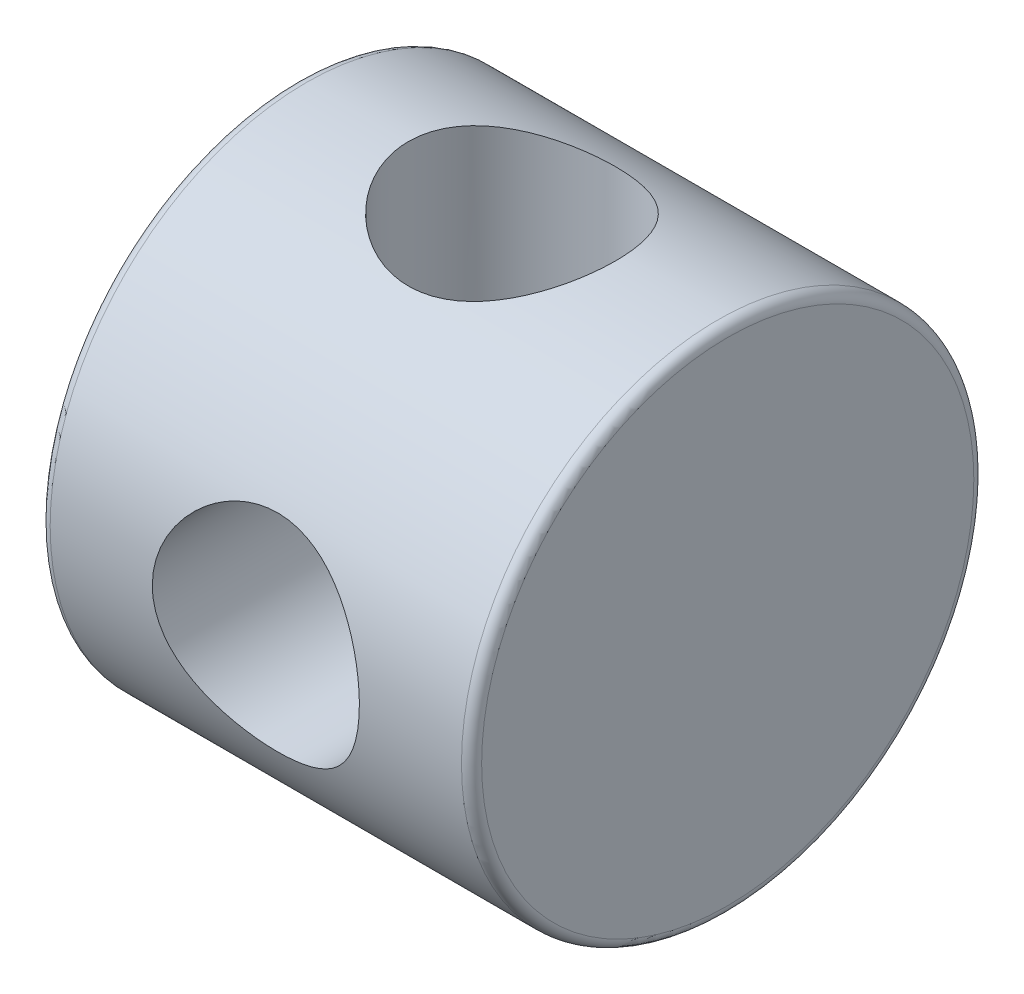
ISO-10303-21;
HEADER;
FILE_DESCRIPTION(('STEP AP214'),'2;1');
FILE_NAME('part.step','',(''),(''),'','','');
FILE_SCHEMA(('AUTOMOTIVE_DESIGN { 1 0 10303 214 1 1 1 1 }'));
ENDSEC;
DATA;
#1=APPLICATION_CONTEXT('core data for automotive mechanical design processes');
#2=APPLICATION_PROTOCOL_DEFINITION('international standard','automotive_design',2000,#1);
#3=PRODUCT_CONTEXT('',#1,'mechanical');
#4=PRODUCT('Part','Part','',(#3));
#5=PRODUCT_RELATED_PRODUCT_CATEGORY('part','',(#4));
#6=PRODUCT_DEFINITION_FORMATION('','',#4);
#7=PRODUCT_DEFINITION_CONTEXT('part definition',#1,'design');
#8=PRODUCT_DEFINITION('design','',#6,#7);
#9=PRODUCT_DEFINITION_SHAPE('','',#8);
#10=(LENGTH_UNIT() NAMED_UNIT(*) SI_UNIT(.MILLI.,.METRE.));
#11=(NAMED_UNIT(*) PLANE_ANGLE_UNIT() SI_UNIT($,.RADIAN.));
#12=(NAMED_UNIT(*) SI_UNIT($,.STERADIAN.) SOLID_ANGLE_UNIT());
#13=UNCERTAINTY_MEASURE_WITH_UNIT(LENGTH_MEASURE(1.E-05),#10,'distance_accuracy_value','');
#14=(GEOMETRIC_REPRESENTATION_CONTEXT(3) GLOBAL_UNCERTAINTY_ASSIGNED_CONTEXT((#13)) GLOBAL_UNIT_ASSIGNED_CONTEXT((#10,
#11,#12)) REPRESENTATION_CONTEXT('',''));
#15=CARTESIAN_POINT('',(0.,0.,0.));
#16=DIRECTION('',(0.,0.,1.));
#17=DIRECTION('',(1.,0.,0.));
#18=AXIS2_PLACEMENT_3D('',#15,#16,#17);
#19=CARTESIAN_POINT('',(-1.651,-2.413,0.));
#20=DIRECTION('',(0.,1.,0.));
#21=DIRECTION('',(0.,0.,1.));
#22=AXIS2_PLACEMENT_3D('',#19,#20,#21);
#23=CYLINDRICAL_SURFACE('',#22,0.975);
#24=CARTESIAN_POINT('',(-1.651,-2.20724806036839,0.975));
#25=CARTESIAN_POINT('',(-1.59877755671493,-2.20725136965086,0.974996773633798));
#26=CARTESIAN_POINT('',(-1.54650902392363,-2.20912596864469,0.970782539566692));
#27=CARTESIAN_POINT('',(-1.44351572456661,-2.21638016304338,0.954099655404558));
#28=CARTESIAN_POINT('',(-1.39279339872527,-2.22176502709611,0.941618596965268));
#29=CARTESIAN_POINT('',(-1.29449823912022,-2.23532397381558,0.908957978076945));
#30=CARTESIAN_POINT('',(-1.24691524401246,-2.24348847115901,0.888804846248834));
#31=CARTESIAN_POINT('',(-1.15580284980478,-2.2616734513362,0.841452953470062));
#32=CARTESIAN_POINT('',(-1.11227368096481,-2.27169403950062,0.814253792631827));
#33=CARTESIAN_POINT('',(-1.02795858989517,-2.29311435268041,0.751888917062757));
#34=CARTESIAN_POINT('',(-0.987439167953577,-2.30455897362016,0.716378183947321));
#35=CARTESIAN_POINT('',(-0.912737712380074,-2.32716684485715,0.639126128743022));
#36=CARTESIAN_POINT('',(-0.878557539137137,-2.33833001172777,0.597382984085831));
#37=CARTESIAN_POINT('',(-0.816166937755971,-2.35965989144668,0.506777322457651));
#38=CARTESIAN_POINT('',(-0.788253444666864,-2.3697681340365,0.457695327279943));
#39=CARTESIAN_POINT('',(-0.741193322843783,-2.38730249445335,0.355050045402772));
#40=CARTESIAN_POINT('',(-0.722043143558416,-2.39472969827422,0.301488584029474));
#41=CARTESIAN_POINT('',(-0.694010239372981,-2.40574634361331,0.194206094004759));
#42=CARTESIAN_POINT('',(-0.684667912512863,-2.40950692053236,0.140623087150691));
#43=CARTESIAN_POINT('',(-0.675034701000536,-2.41338589796678,0.0325267451879902));
#44=CARTESIAN_POINT('',(-0.674740381441646,-2.41350568064138,-0.0219862290119944));
#45=CARTESIAN_POINT('',(-0.682962300761365,-2.41019287567636,-0.12706852357368));
#46=CARTESIAN_POINT('',(-0.690974690990237,-2.40696343347413,-0.17768484127352));
#47=CARTESIAN_POINT('',(-0.7147239809174,-2.39759010740608,-0.276783279938089));
#48=CARTESIAN_POINT('',(-0.730461448882279,-2.39144600913553,-0.325265243611066));
#49=CARTESIAN_POINT('',(-0.76940653322892,-2.37672510450613,-0.419597705462042));
#50=CARTESIAN_POINT('',(-0.792723693736028,-2.36811285813551,-0.46539721892244));
#51=CARTESIAN_POINT('',(-0.846061765566593,-2.34930790001654,-0.55255041865166));
#52=CARTESIAN_POINT('',(-0.876084748319131,-2.3391147002095,-0.593902725317822));
#53=CARTESIAN_POINT('',(-0.944315075369865,-2.31737655695153,-0.673919192397163));
#54=CARTESIAN_POINT('',(-0.982934756361208,-2.30578680064105,-0.712220064461278));
#55=CARTESIAN_POINT('',(-1.06610249265835,-2.28307925372254,-0.781963440252376));
#56=CARTESIAN_POINT('',(-1.11065417607525,-2.27196175748972,-0.813401715391774));
#57=CARTESIAN_POINT('',(-1.20609306022927,-2.25114527699373,-0.86938753610472));
#58=CARTESIAN_POINT('',(-1.25713009687433,-2.24149877809259,-0.893700384128966));
#59=CARTESIAN_POINT('',(-1.36302132852767,-2.22534500614951,-0.933204805955091));
#60=CARTESIAN_POINT('',(-1.41786698381921,-2.21883095402306,-0.948416094496458));
#61=CARTESIAN_POINT('',(-1.50288765684779,-2.21201898014966,-0.964142810086234));
#62=CARTESIAN_POINT('',(-1.53232935311935,-2.21023810279291,-0.968207291965666));
#63=CARTESIAN_POINT('',(-1.59150904818929,-2.20785170648248,-0.973636791569329));
#64=CARTESIAN_POINT('',(-1.62124704381423,-2.20724617495415,-0.975001838173956));
#65=CARTESIAN_POINT('',(-1.70322244328691,-2.2072513696509,-0.9749967736337));
#66=CARTESIAN_POINT('',(-1.75549097607823,-2.20912596864478,-0.970782539566492));
#67=CARTESIAN_POINT('',(-1.85848427543525,-2.21638016304355,-0.954099655404155));
#68=CARTESIAN_POINT('',(-1.90920660127658,-2.22176502709633,-0.941618596964761));
#69=CARTESIAN_POINT('',(-2.00750176088159,-2.23532397381587,-0.908957978076235));
#70=CARTESIAN_POINT('',(-2.05508475598932,-2.24348847115933,-0.888804846248024));
#71=CARTESIAN_POINT('',(-2.14619715019693,-2.26167345133658,-0.841452953469054));
#72=CARTESIAN_POINT('',(-2.18972631903686,-2.27169403950102,-0.814253792630722));
#73=CARTESIAN_POINT('',(-2.2740414101064,-2.29311435268084,-0.751888917061453));
#74=CARTESIAN_POINT('',(-2.31456083204794,-2.3045589736206,-0.716378183945915));
#75=CARTESIAN_POINT('',(-2.38926228762132,-2.3271668448576,-0.639126128741417));
#76=CARTESIAN_POINT('',(-2.42344246086418,-2.33833001172821,-0.597382984084128));
#77=CARTESIAN_POINT('',(-2.48583306224516,-2.35965989144708,-0.506777322455784));
#78=CARTESIAN_POINT('',(-2.51374655533416,-2.36976813403687,-0.457695327278012));
#79=CARTESIAN_POINT('',(-2.56080667715701,-2.38730249445366,-0.355050045400732));
#80=CARTESIAN_POINT('',(-2.57995685644226,-2.39472969827449,-0.301488584027389));
#81=CARTESIAN_POINT('',(-2.60798976062745,-2.40574634361348,-0.194206094002631));
#82=CARTESIAN_POINT('',(-2.61733208748745,-2.40950692053248,-0.140623087148566));
#83=CARTESIAN_POINT('',(-2.62696529899953,-2.41338589796681,-0.0325267451858946));
#84=CARTESIAN_POINT('',(-2.62725961855831,-2.41350568064136,0.0219862290140636));
#85=CARTESIAN_POINT('',(-2.61903769923837,-2.41019287567625,0.127068523575694));
#86=CARTESIAN_POINT('',(-2.6110253090094,-2.40696343347399,0.177684841275506));
#87=CARTESIAN_POINT('',(-2.58727601908203,-2.39759010740585,0.276783279940002));
#88=CARTESIAN_POINT('',(-2.57153855111706,-2.39144600913528,0.325265243612935));
#89=CARTESIAN_POINT('',(-2.53259346677023,-2.37672510450582,0.419597705463831));
#90=CARTESIAN_POINT('',(-2.50927630626302,-2.36811285813517,0.465397218924194));
#91=CARTESIAN_POINT('',(-2.45593823443226,-2.34930790001615,0.552550418653326));
#92=CARTESIAN_POINT('',(-2.42591525167963,-2.33911470020909,0.593902725319438));
#93=CARTESIAN_POINT('',(-2.35768492462871,-2.31737655695109,0.673919192398663));
#94=CARTESIAN_POINT('',(-2.31906524363727,-2.30578680064061,0.712220064462711));
#95=CARTESIAN_POINT('',(-2.23589750733993,-2.2830792537221,0.781963440253659));
#96=CARTESIAN_POINT('',(-2.19134582392295,-2.27196175748929,0.813401715392974));
#97=CARTESIAN_POINT('',(-2.09590693976878,-2.25114527699334,0.869387536105719));
#98=CARTESIAN_POINT('',(-2.04486990312367,-2.24149877809224,0.89370038412985));
#99=CARTESIAN_POINT('',(-1.93897867147023,-2.22534500614923,0.933204805955737));
#100=CARTESIAN_POINT('',(-1.88413301617867,-2.21883095402283,0.948416094496981));
#101=CARTESIAN_POINT('',(-1.79911234315071,-2.21201898014957,0.964142810086445));
#102=CARTESIAN_POINT('',(-1.76967064687981,-2.21023810279287,0.968207291965749));
#103=CARTESIAN_POINT('',(-1.7104909518112,-2.2078517064825,0.973636791569279));
#104=CARTESIAN_POINT('',(-1.68075295618693,-2.20724617495418,0.9750018381739));
#105=CARTESIAN_POINT('',(-1.651,-2.20724806036839,0.975));
#106=B_SPLINE_CURVE_WITH_KNOTS('',3,(#24,#25,#26,#27,#28,#29,#30,#31,#32,#33,#34,#35,#36,#37,
#38,#39,#40,#41,#42,#43,#44,#45,#46,#47,#48,#49,#50,#51,#52,#53,#54,#55,#56,#57,#58,#59,#60,#61,
#62,#63,#64,#65,#66,#67,#68,#69,#70,#71,#72,#73,#74,#75,#76,#77,#78,#79,#80,#81,#82,#83,#84,#85,
#86,#87,#88,#89,#90,#91,#92,#93,#94,#95,#96,#97,#98,#99,#100,#101,#102,#103,#104,#105),
.UNSPECIFIED.,.T.,.F.,(4,2,2,2,2,2,2,2,2,2,2,2,2,2,2,2,2,2,2,2,2,2,2,2,2,2,2,2,2,2,2,2,2,2,2,2,
2,2,2,2,4),(0.,0.156550021056958,0.313335554797947,0.469585813392964,0.625844941697533,
0.790361033050518,0.954925329057369,1.12613745409596,1.29728014913808,1.45998631039723,
1.6226307025434,1.77595612718014,1.92929283232159,2.08495222632276,2.24065977018697,
2.40675333232753,2.57294895072256,2.74412440058883,2.91492771505445,3.00412070293595,
3.09331273656504,3.24986275762206,3.4066482913631,3.56289854995818,3.7191576782628,
3.88367376961587,4.0482380656228,4.21945019066138,4.39059288570349,4.55329904696256,
4.71594343910865,4.86926886374536,5.02260556888679,5.17826496288801,5.33397250675227,
5.5000660688929,5.666261687288,5.83743713715425,6.00824045161985,6.09743343949935,
6.18662547312643),.UNSPECIFIED.);
#107=CARTESIAN_POINT('',(-1.651,-2.20724806036839,0.975));
#108=VERTEX_POINT('',#107);
#109=EDGE_CURVE('E62',#108,#108,#106,.T.);
#110=ORIENTED_EDGE('',*,*,#109,.F.);
#111=EDGE_LOOP('',(#110));
#112=FACE_BOUND('',#111,.T.);
#113=CARTESIAN_POINT('',(-1.651,0.,0.));
#114=DIRECTION('',(0.,0.707106781186547,-0.707106781186547));
#115=DIRECTION('',(0.,0.707106781186547,0.707106781186547));
#116=AXIS2_PLACEMENT_3D('',#113,#114,#115);
#117=ELLIPSE('',#116,1.37885822331377,0.975);
#118=CARTESIAN_POINT('',(-0.676,0.,0.));
#119=VERTEX_POINT('',#118);
#120=CARTESIAN_POINT('',(-2.626,0.,0.));
#121=VERTEX_POINT('',#120);
#122=EDGE_CURVE('E56',#119,#121,#117,.T.);
#123=ORIENTED_EDGE('',*,*,#122,.T.);
#124=CARTESIAN_POINT('',(-1.651,0.,0.));
#125=DIRECTION('',(0.,0.707106781186547,0.707106781186547));
#126=DIRECTION('',(0.,0.707106781186547,-0.707106781186547));
#127=AXIS2_PLACEMENT_3D('',#124,#125,#126);
#128=ELLIPSE('',#127,1.37885822331377,0.975);
#129=EDGE_CURVE('E51',#121,#119,#128,.T.);
#130=ORIENTED_EDGE('',*,*,#129,.T.);
#131=EDGE_LOOP('',(#123,#130));
#132=FACE_BOUND('',#131,.T.);
#133=ADVANCED_FACE('F16',(#112,#132),#23,.F.);
#134=CARTESIAN_POINT('',(0.380999999999999,4.42903274039352,-2.41346096080457));
#135=DIRECTION('',(-1.,0.,0.));
#136=DIRECTION('',(0.,-1.,0.));
#137=AXIS2_PLACEMENT_3D('',#134,#135,#136);
#138=PLANE('',#137);
#139=CARTESIAN_POINT('',(0.380999999999999,0.,0.));
#140=DIRECTION('',(-1.,0.,0.));
#141=DIRECTION('',(0.,-1.,0.));
#142=AXIS2_PLACEMENT_3D('',#139,#140,#141);
#143=CIRCLE('',#142,2.318);
#144=CARTESIAN_POINT('',(0.381,-2.318,0.));
#145=VERTEX_POINT('',#144);
#146=CARTESIAN_POINT('',(0.380999999999999,2.318,0.));
#147=VERTEX_POINT('',#146);
#148=EDGE_CURVE('E71',#145,#147,#143,.T.);
#149=ORIENTED_EDGE('',*,*,#148,.F.);
#150=CARTESIAN_POINT('',(0.380999999999999,0.,0.));
#151=DIRECTION('',(-1.,0.,0.));
#152=DIRECTION('',(0.,1.,0.));
#153=AXIS2_PLACEMENT_3D('',#150,#151,#152);
#154=CIRCLE('',#153,2.318);
#155=EDGE_CURVE('E74',#147,#145,#154,.T.);
#156=ORIENTED_EDGE('',*,*,#155,.F.);
#157=EDGE_LOOP('',(#149,#156));
#158=FACE_BOUND('',#157,.T.);
#159=ADVANCED_FACE('F143',(#158),#138,.F.);
#160=CARTESIAN_POINT('',(-3.683,3.52414946477353,-2.41346096080457));
#161=DIRECTION('',(1.,0.,0.));
#162=DIRECTION('',(0.,1.,0.));
#163=AXIS2_PLACEMENT_3D('',#160,#161,#162);
#164=PLANE('',#163);
#165=CARTESIAN_POINT('',(-3.683,0.,0.));
#166=DIRECTION('',(1.,0.,0.));
#167=DIRECTION('',(0.,1.,0.));
#168=AXIS2_PLACEMENT_3D('',#165,#166,#167);
#169=CIRCLE('',#168,2.318);
#170=CARTESIAN_POINT('',(-3.683,2.318,0.));
#171=VERTEX_POINT('',#170);
#172=CARTESIAN_POINT('',(-3.683,-2.318,0.));
#173=VERTEX_POINT('',#172);
#174=EDGE_CURVE('E69',#171,#173,#169,.T.);
#175=ORIENTED_EDGE('',*,*,#174,.F.);
#176=CARTESIAN_POINT('',(-3.683,0.,0.));
#177=DIRECTION('',(1.,0.,0.));
#178=DIRECTION('',(0.,-1.,0.));
#179=AXIS2_PLACEMENT_3D('',#176,#177,#178);
#180=CIRCLE('',#179,2.318);
#181=EDGE_CURVE('E36',#173,#171,#180,.T.);
#182=ORIENTED_EDGE('',*,*,#181,.F.);
#183=EDGE_LOOP('',(#175,#182));
#184=FACE_BOUND('',#183,.T.);
#185=ADVANCED_FACE('F135',(#184),#164,.F.);
#186=CARTESIAN_POINT('',(-1.651,-2.413,0.));
#187=DIRECTION('',(0.,1.,0.));
#188=DIRECTION('',(0.,0.,1.));
#189=AXIS2_PLACEMENT_3D('',#186,#187,#188);
#190=CYLINDRICAL_SURFACE('',#189,0.975);
#191=CARTESIAN_POINT('',(-1.651,2.20724806036839,-0.975));
#192=CARTESIAN_POINT('',(-1.59877755671493,2.20725136965086,-0.974996773633798));
#193=CARTESIAN_POINT('',(-1.54650902392363,2.20912596864469,-0.970782539566691));
#194=CARTESIAN_POINT('',(-1.44351572456661,2.21638016304338,-0.954099655404558));
#195=CARTESIAN_POINT('',(-1.39279339872527,2.22176502709611,-0.941618596965267));
#196=CARTESIAN_POINT('',(-1.29449823912022,2.23532397381558,-0.908957978076944));
#197=CARTESIAN_POINT('',(-1.24691524401246,2.24348847115901,-0.888804846248833));
#198=CARTESIAN_POINT('',(-1.15580284980478,2.2616734513362,-0.841452953470062));
#199=CARTESIAN_POINT('',(-1.11227368096481,2.27169403950062,-0.814253792631826));
#200=CARTESIAN_POINT('',(-1.02795858989517,2.29311435268041,-0.751888917062756));
#201=CARTESIAN_POINT('',(-0.987439167953577,2.30455897362016,-0.71637818394732));
#202=CARTESIAN_POINT('',(-0.912737712380073,2.32716684485715,-0.639126128743021));
#203=CARTESIAN_POINT('',(-0.878557539137137,2.33833001172777,-0.59738298408583));
#204=CARTESIAN_POINT('',(-0.816166937755971,2.35965989144668,-0.506777322457651));
#205=CARTESIAN_POINT('',(-0.788253444666864,2.3697681340365,-0.457695327279943));
#206=CARTESIAN_POINT('',(-0.741193322843783,2.38730249445335,-0.355050045402772));
#207=CARTESIAN_POINT('',(-0.722043143558416,2.39472969827422,-0.301488584029473));
#208=CARTESIAN_POINT('',(-0.694010239372981,2.40574634361331,-0.194206094004758));
#209=CARTESIAN_POINT('',(-0.684667912512863,2.40950692053236,-0.14062308715069));
#210=CARTESIAN_POINT('',(-0.675034701000536,2.41338589796678,-0.0325267451879896));
#211=CARTESIAN_POINT('',(-0.674740381441645,2.41350568064138,0.0219862290119949));
#212=CARTESIAN_POINT('',(-0.682962300761365,2.41019287567636,0.127068523573681));
#213=CARTESIAN_POINT('',(-0.690974690990237,2.40696343347413,0.177684841273521));
#214=CARTESIAN_POINT('',(-0.7147239809174,2.39759010740608,0.276783279938089));
#215=CARTESIAN_POINT('',(-0.730461448882279,2.39144600913553,0.325265243611067));
#216=CARTESIAN_POINT('',(-0.76940653322892,2.37672510450613,0.419597705462042));
#217=CARTESIAN_POINT('',(-0.792723693736028,2.36811285813551,0.465397218922441));
#218=CARTESIAN_POINT('',(-0.846061765566594,2.34930790001654,0.55255041865166));
#219=CARTESIAN_POINT('',(-0.876084748319131,2.3391147002095,0.593902725317823));
#220=CARTESIAN_POINT('',(-0.944315075369866,2.31737655695153,0.673919192397163));
#221=CARTESIAN_POINT('',(-0.982934756361208,2.30578680064105,0.712220064461279));
#222=CARTESIAN_POINT('',(-1.06610249265835,2.28307925372254,0.781963440252377));
#223=CARTESIAN_POINT('',(-1.11065417607525,2.27196175748972,0.813401715391774));
#224=CARTESIAN_POINT('',(-1.20609306022927,2.25114527699373,0.869387536104721));
#225=CARTESIAN_POINT('',(-1.25713009687433,2.24149877809259,0.893700384128967));
#226=CARTESIAN_POINT('',(-1.36302132852768,2.2253450061495,0.933204805955092));
#227=CARTESIAN_POINT('',(-1.41786698381921,2.21883095402306,0.948416094496459));
#228=CARTESIAN_POINT('',(-1.5028876568475,2.21201898014968,0.96414281008618));
#229=CARTESIAN_POINT('',(-1.53232935311875,2.21023810279294,0.968207291965583));
#230=CARTESIAN_POINT('',(-1.59150904818807,2.20785170648251,0.973636791569246));
#231=CARTESIAN_POINT('',(-1.62124704381271,2.20724617495418,0.9750018381739));
#232=CARTESIAN_POINT('',(-1.70322244328507,2.20725136965086,0.974996773633798));
#233=CARTESIAN_POINT('',(-1.75549097607637,2.20912596864469,0.970782539566691));
#234=CARTESIAN_POINT('',(-1.85848427543339,2.21638016304338,0.954099655404558));
#235=CARTESIAN_POINT('',(-1.90920660127473,2.22176502709611,0.941618596965268));
#236=CARTESIAN_POINT('',(-2.00750176087978,2.23532397381558,0.908957978076945));
#237=CARTESIAN_POINT('',(-2.05508475598754,2.24348847115901,0.888804846248834));
#238=CARTESIAN_POINT('',(-2.14619715019522,2.2616734513362,0.841452953470062));
#239=CARTESIAN_POINT('',(-2.18972631903519,2.27169403950062,0.814253792631827));
#240=CARTESIAN_POINT('',(-2.27404141010483,2.29311435268041,0.751888917062757));
#241=CARTESIAN_POINT('',(-2.31456083204642,2.30455897362016,0.716378183947321));
#242=CARTESIAN_POINT('',(-2.38926228761993,2.32716684485715,0.639126128743022));
#243=CARTESIAN_POINT('',(-2.42344246086286,2.33833001172777,0.597382984085831));
#244=CARTESIAN_POINT('',(-2.48583306224403,2.35965989144668,0.506777322457651));
#245=CARTESIAN_POINT('',(-2.51374655533314,2.3697681340365,0.457695327279943));
#246=CARTESIAN_POINT('',(-2.56080667715622,2.38730249445335,0.355050045402772));
#247=CARTESIAN_POINT('',(-2.57995685644158,2.39472969827422,0.301488584029474));
#248=CARTESIAN_POINT('',(-2.60798976062702,2.40574634361331,0.194206094004758));
#249=CARTESIAN_POINT('',(-2.61733208748714,2.40950692053236,0.14062308715069));
#250=CARTESIAN_POINT('',(-2.62696529899946,2.41338589796678,0.0325267451879897));
#251=CARTESIAN_POINT('',(-2.62725961855835,2.41350568064138,-0.0219862290119947));
#252=CARTESIAN_POINT('',(-2.61903769923864,2.41019287567636,-0.12706852357368));
#253=CARTESIAN_POINT('',(-2.61102530900976,2.40696343347413,-0.17768484127352));
#254=CARTESIAN_POINT('',(-2.5872760190826,2.39759010740608,-0.276783279938089));
#255=CARTESIAN_POINT('',(-2.57153855111772,2.39144600913553,-0.325265243611067));
#256=CARTESIAN_POINT('',(-2.53259346677108,2.37672510450613,-0.419597705462042));
#257=CARTESIAN_POINT('',(-2.50927630626397,2.36811285813551,-0.46539721892244));
#258=CARTESIAN_POINT('',(-2.45593823443341,2.34930790001654,-0.55255041865166));
#259=CARTESIAN_POINT('',(-2.42591525168087,2.3391147002095,-0.593902725317822));
#260=CARTESIAN_POINT('',(-2.35768492463014,2.31737655695153,-0.673919192397163));
#261=CARTESIAN_POINT('',(-2.31906524363879,2.30578680064105,-0.712220064461278));
#262=CARTESIAN_POINT('',(-2.23589750734165,2.28307925372254,-0.781963440252376));
#263=CARTESIAN_POINT('',(-2.19134582392475,2.27196175748972,-0.813401715391774));
#264=CARTESIAN_POINT('',(-2.09590693977073,2.25114527699373,-0.869387536104721));
#265=CARTESIAN_POINT('',(-2.04486990312567,2.24149877809259,-0.893700384128966));
#266=CARTESIAN_POINT('',(-1.93897867147233,2.2253450061495,-0.933204805955091));
#267=CARTESIAN_POINT('',(-1.88413301618079,2.21883095402306,-0.948416094496458));
#268=CARTESIAN_POINT('',(-1.79911234315251,2.21201898014968,-0.964142810086179));
#269=CARTESIAN_POINT('',(-1.76967064688125,2.21023810279294,-0.968207291965583));
#270=CARTESIAN_POINT('',(-1.71049095181193,2.20785170648251,-0.973636791569245));
#271=CARTESIAN_POINT('',(-1.68075295618729,2.20724617495418,-0.9750018381739));
#272=CARTESIAN_POINT('',(-1.651,2.20724806036839,-0.975));
#273=B_SPLINE_CURVE_WITH_KNOTS('',3,(#191,#192,#193,#194,#195,#196,#197,#198,#199,#200,#201,
#202,#203,#204,#205,#206,#207,#208,#209,#210,#211,#212,#213,#214,#215,#216,#217,#218,#219,#220,
#221,#222,#223,#224,#225,#226,#227,#228,#229,#230,#231,#232,#233,#234,#235,#236,#237,#238,#239,
#240,#241,#242,#243,#244,#245,#246,#247,#248,#249,#250,#251,#252,#253,#254,#255,#256,#257,#258,
#259,#260,#261,#262,#263,#264,#265,#266,#267,#268,#269,#270,#271,#272),.UNSPECIFIED.,.T.,.F.,(4,
2,2,2,2,2,2,2,2,2,2,2,2,2,2,2,2,2,2,2,2,2,2,2,2,2,2,2,2,2,2,2,2,2,2,2,2,2,2,2,4),(0.,
0.156550021056959,0.313335554797947,0.469585813392963,0.625844941697532,0.790361033050518,
0.954925329057369,1.12613745409596,1.29728014913808,1.45998631039722,1.6226307025434,
1.77595612718014,1.92929283232159,2.08495222632276,2.24065977018697,2.40675333232753,
2.57294895072256,2.74412440058883,2.91492771505445,3.00412070293504,3.09331273656321,
3.24986275762017,3.40664829136116,3.56289854995618,3.71915767826074,3.88367376961373,
4.04823806562058,4.21945019065917,4.3905928857013,4.55329904696044,4.71594343910662,
4.86926886374335,5.0226055688848,5.17826496288597,5.33397250675019,5.50006606889074,
5.66626168728578,5.83743713715204,6.00824045161766,6.09743343949826,6.18662547312643),.UNSPECIFIED.);
#274=CARTESIAN_POINT('',(-1.651,2.20724806036839,-0.975));
#275=VERTEX_POINT('',#274);
#276=EDGE_CURVE('E68',#275,#275,#273,.T.);
#277=ORIENTED_EDGE('',*,*,#276,.F.);
#278=EDGE_LOOP('',(#277));
#279=FACE_BOUND('',#278,.T.);
#280=CARTESIAN_POINT('',(-1.651,0.,0.));
#281=DIRECTION('',(0.,0.707106781186547,-0.707106781186547));
#282=DIRECTION('',(0.,0.707106781186547,0.707106781186547));
#283=AXIS2_PLACEMENT_3D('',#280,#281,#282);
#284=ELLIPSE('',#283,1.37885822331377,0.975);
#285=EDGE_CURVE('E64',#119,#121,#284,.F.);
#286=ORIENTED_EDGE('',*,*,#285,.T.);
#287=CARTESIAN_POINT('',(-1.651,0.,0.));
#288=DIRECTION('',(0.,0.707106781186547,0.707106781186547));
#289=DIRECTION('',(0.,0.707106781186547,-0.707106781186547));
#290=AXIS2_PLACEMENT_3D('',#287,#288,#289);
#291=ELLIPSE('',#290,1.37885822331377,0.975);
#292=EDGE_CURVE('E59',#121,#119,#291,.F.);
#293=ORIENTED_EDGE('',*,*,#292,.T.);
#294=EDGE_LOOP('',(#286,#293));
#295=FACE_BOUND('',#294,.T.);
#296=ADVANCED_FACE('F73',(#279,#295),#190,.F.);
#297=CARTESIAN_POINT('',(0.285999999999999,0.,0.));
#298=DIRECTION('',(-1.,0.,0.));
#299=DIRECTION('',(0.,-1.,0.));
#300=AXIS2_PLACEMENT_3D('',#297,#298,#299);
#301=TOROIDAL_SURFACE('',#300,2.318,0.095);
#302=ORIENTED_EDGE('',*,*,#148,.T.);
#303=ORIENTED_EDGE('',*,*,#155,.T.);
#304=EDGE_LOOP('',(#302,#303));
#305=FACE_BOUND('',#304,.T.);
#306=CARTESIAN_POINT('',(0.285999999999999,0.,0.));
#307=DIRECTION('',(-1.,0.,0.));
#308=DIRECTION('',(0.,0.,1.));
#309=AXIS2_PLACEMENT_3D('',#306,#307,#308);
#310=CIRCLE('',#309,2.413);
#311=CARTESIAN_POINT('',(0.285999999999999,0.,2.413));
#312=VERTEX_POINT('',#311);
#313=EDGE_CURVE('E112',#312,#312,#310,.T.);
#314=ORIENTED_EDGE('',*,*,#313,.F.);
#315=EDGE_LOOP('',(#314));
#316=FACE_BOUND('',#315,.T.);
#317=ADVANCED_FACE('F116',(#305,#316),#301,.T.);
#318=CARTESIAN_POINT('',(-1.651,0.,2.8956));
#319=DIRECTION('',(0.,0.,1.));
#320=DIRECTION('',(1.,0.,0.));
#321=AXIS2_PLACEMENT_3D('',#318,#319,#320);
#322=CYLINDRICAL_SURFACE('',#321,0.975);
#323=CARTESIAN_POINT('',(-0.676,0.,-2.413));
#324=CARTESIAN_POINT('',(-0.676003048672495,0.0524192797178934,-2.41299757150437));
#325=CARTESIAN_POINT('',(-0.680247961883116,0.104883766532461,-2.41127389454774));
#326=CARTESIAN_POINT('',(-0.697063930084181,0.208286643720665,-2.4045542088167));
#327=CARTESIAN_POINT('',(-0.709646805656827,0.259222760034982,-2.39955355444074));
#328=CARTESIAN_POINT('',(-0.742604504741471,0.357972353383365,-2.38681732626237));
#329=CARTESIAN_POINT('',(-0.762957297514907,0.405794215825943,-2.37908948972323));
#330=CARTESIAN_POINT('',(-0.810781134749991,0.497318154515663,-2.36165560430506));
#331=CARTESIAN_POINT('',(-0.838252132095573,0.541020258029265,-2.35194956852));
#332=CARTESIAN_POINT('',(-0.900914587678657,0.625194614243632,-2.33102196243601));
#333=CARTESIAN_POINT('',(-0.936390002038192,0.6654435437311,-2.31975282028728));
#334=CARTESIAN_POINT('',(-1.01345226249817,0.739607864508122,-2.29718410181641));
#335=CARTESIAN_POINT('',(-1.05504166782053,0.77352058999536,-2.28588451470434));
#336=CARTESIAN_POINT('',(-1.14545807892162,0.835579482188812,-2.26395892285285));
#337=CARTESIAN_POINT('',(-1.19452882500372,0.863391700659085,-2.25338722102658));
#338=CARTESIAN_POINT('',(-1.29714321878312,0.910267964230194,-2.23486493212679));
#339=CARTESIAN_POINT('',(-1.3506847453491,0.92933613032268,-2.22691311082612));
#340=CARTESIAN_POINT('',(-1.45814560320768,0.957272101487777,-2.21504430076585));
#341=CARTESIAN_POINT('',(-1.51193397291927,0.966569234366888,-2.21095835607813));
#342=CARTESIAN_POINT('',(-1.62045060354236,0.976039993306082,-2.20679507589409));
#343=CARTESIAN_POINT('',(-1.67517837564479,0.976218228460436,-2.20671571529323));
#344=CARTESIAN_POINT('',(-1.77985969444878,0.96777095308543,-2.21043073954574));
#345=CARTESIAN_POINT('',(-1.82987550321283,0.959772015070068,-2.21394943031482));
#346=CARTESIAN_POINT('',(-1.92778284176793,0.936243668677696,-2.22400060688097));
#347=CARTESIAN_POINT('',(-1.97567398814235,0.920712907092471,-2.23053363423984));
#348=CARTESIAN_POINT('',(-2.06914225023588,0.882263841396573,-2.24602206306828));
#349=CARTESIAN_POINT('',(-2.11465115742359,0.859199604155899,-2.25502470170435));
#350=CARTESIAN_POINT('',(-2.20132057642492,0.806441811121164,-2.27442500824467));
#351=CARTESIAN_POINT('',(-2.24247959904566,0.776745995752918,-2.28482315115535));
#352=CARTESIAN_POINT('',(-2.32270074613781,0.708814918223047,-2.30684231608088));
#353=CARTESIAN_POINT('',(-2.36134126033724,0.670090782658864,-2.31849509548166));
#354=CARTESIAN_POINT('',(-2.43172753189218,0.586576976514305,-2.34101798456269));
#355=CARTESIAN_POINT('',(-2.4634699162284,0.541784355891285,-2.35188770961946));
#356=CARTESIAN_POINT('',(-2.51973110668088,0.446175392097369,-2.37190446676044));
#357=CARTESIAN_POINT('',(-2.54408292376607,0.39525167851001,-2.38101019874463));
#358=CARTESIAN_POINT('',(-2.58369261620943,0.289615988929801,-2.39614715104733));
#359=CARTESIAN_POINT('',(-2.59896870730739,0.234911848750752,-2.40218452626703));
#360=CARTESIAN_POINT('',(-2.61490333004656,0.149730077360842,-2.40853309336051));
#361=CARTESIAN_POINT('',(-2.61905777159819,0.119966033116169,-2.4102019629767));
#362=CARTESIAN_POINT('',(-2.62460696629219,0.060139618212622,-2.41243610704387));
#363=CARTESIAN_POINT('',(-2.62600174927408,0.0300772507829767,-2.41300139342762));
#364=CARTESIAN_POINT('',(-2.6259969513275,-0.0524192797178929,-2.41299757150437));
#365=CARTESIAN_POINT('',(-2.62175203811688,-0.10488376653246,-2.41127389454774));
#366=CARTESIAN_POINT('',(-2.60493606991582,-0.208286643720664,-2.4045542088167));
#367=CARTESIAN_POINT('',(-2.59235319434317,-0.259222760034981,-2.39955355444074));
#368=CARTESIAN_POINT('',(-2.55939549525853,-0.357972353383364,-2.38681732626237));
#369=CARTESIAN_POINT('',(-2.53904270248509,-0.405794215825943,-2.37908948972323));
#370=CARTESIAN_POINT('',(-2.49121886525001,-0.497318154515662,-2.36165560430506));
#371=CARTESIAN_POINT('',(-2.46374786790443,-0.541020258029265,-2.35194956852));
#372=CARTESIAN_POINT('',(-2.40108541232134,-0.625194614243632,-2.33102196243601));
#373=CARTESIAN_POINT('',(-2.36560999796181,-0.665443543731099,-2.31975282028728));
#374=CARTESIAN_POINT('',(-2.28854773750183,-0.739607864508121,-2.29718410181641));
#375=CARTESIAN_POINT('',(-2.24695833217947,-0.77352058999536,-2.28588451470434));
#376=CARTESIAN_POINT('',(-2.15654192107838,-0.835579482188812,-2.26395892285285));
#377=CARTESIAN_POINT('',(-2.10747117499628,-0.863391700659085,-2.25338722102658));
#378=CARTESIAN_POINT('',(-2.00485678121688,-0.910267964230194,-2.23486493212679));
#379=CARTESIAN_POINT('',(-1.9513152546509,-0.92933613032268,-2.22691311082612));
#380=CARTESIAN_POINT('',(-1.84385439679232,-0.957272101487777,-2.21504430076585));
#381=CARTESIAN_POINT('',(-1.79006602708073,-0.966569234366888,-2.21095835607813));
#382=CARTESIAN_POINT('',(-1.68154939645764,-0.976039993306082,-2.20679507589409));
#383=CARTESIAN_POINT('',(-1.62682162435521,-0.976218228460436,-2.20671571529322));
#384=CARTESIAN_POINT('',(-1.52214030555122,-0.96777095308543,-2.21043073954574));
#385=CARTESIAN_POINT('',(-1.47212449678717,-0.959772015070068,-2.21394943031482));
#386=CARTESIAN_POINT('',(-1.37421715823207,-0.936243668677697,-2.22400060688098));
#387=CARTESIAN_POINT('',(-1.32632601185765,-0.920712907092471,-2.23053363423984));
#388=CARTESIAN_POINT('',(-1.23285774976412,-0.882263841396573,-2.24602206306827));
#389=CARTESIAN_POINT('',(-1.18734884257641,-0.859199604155899,-2.25502470170435));
#390=CARTESIAN_POINT('',(-1.10067942357508,-0.806441811121164,-2.27442500824467));
#391=CARTESIAN_POINT('',(-1.05952040095434,-0.776745995752919,-2.28482315115535));
#392=CARTESIAN_POINT('',(-0.979299253862195,-0.708814918223047,-2.30684231608088));
#393=CARTESIAN_POINT('',(-0.940658739662761,-0.670090782658865,-2.31849509548166));
#394=CARTESIAN_POINT('',(-0.870272468107822,-0.586576976514306,-2.34101798456269));
#395=CARTESIAN_POINT('',(-0.838530083771596,-0.541784355891285,-2.35188770961946));
#396=CARTESIAN_POINT('',(-0.782268893319117,-0.44617539209737,-2.37190446676044));
#397=CARTESIAN_POINT('',(-0.757917076233933,-0.39525167851001,-2.38101019874463));
#398=CARTESIAN_POINT('',(-0.718307383790566,-0.289615988929802,-2.39614715104733));
#399=CARTESIAN_POINT('',(-0.703031292692611,-0.234911848750753,-2.40218452626703));
#400=CARTESIAN_POINT('',(-0.687096669953439,-0.149730077360842,-2.40853309336051));
#401=CARTESIAN_POINT('',(-0.682942228401809,-0.11996603311617,-2.4102019629767));
#402=CARTESIAN_POINT('',(-0.677393033707811,-0.0601396182126225,-2.41243610704387));
#403=CARTESIAN_POINT('',(-0.675998250725922,-0.0300772507829768,-2.41300139342762));
#404=CARTESIAN_POINT('',(-0.676,0.,-2.413));
#405=B_SPLINE_CURVE_WITH_KNOTS('',3,(#323,#324,#325,#326,#327,#328,#329,#330,#331,#332,#333,
#334,#335,#336,#337,#338,#339,#340,#341,#342,#343,#344,#345,#346,#347,#348,#349,#350,#351,#352,
#353,#354,#355,#356,#357,#358,#359,#360,#361,#362,#363,#364,#365,#366,#367,#368,#369,#370,#371,
#372,#373,#374,#375,#376,#377,#378,#379,#380,#381,#382,#383,#384,#385,#386,#387,#388,#389,#390,
#391,#392,#393,#394,#395,#396,#397,#398,#399,#400,#401,#402,#403,#404),.UNSPECIFIED.,.T.,.F.,(4,
2,2,2,2,2,2,2,2,2,2,2,2,2,2,2,2,2,2,2,2,2,2,2,2,2,2,2,2,2,2,2,2,2,2,2,2,2,2,2,4),(0.,
0.157141015634628,0.314505285298953,0.471426640678287,0.628346957406917,0.792096195139709,
0.955914171969259,1.12721105560618,1.29842712541286,1.46175794128271,1.62500620171749,
1.77661910980917,1.92825926759428,2.08303086303941,2.23785527441075,2.40489427670966,
2.57201477418563,2.74267009003027,2.91298171902796,3.00314741506378,3.09331213615439,
3.25045315178902,3.40781742145334,3.56473877683268,3.7216590935613,3.8854083312941,
4.04922630812365,4.22052319176057,4.39173926156725,4.5550700774371,4.71831833787188,
4.86993124596356,5.02157140374867,5.1763429991938,5.33116741056514,5.49820641286405,
5.66532691034002,5.83598222618466,6.00629385518235,6.09645955121817,6.18662427230878),.UNSPECIFIED.);
#406=CARTESIAN_POINT('',(-0.676,0.,-2.413));
#407=VERTEX_POINT('',#406);
#408=EDGE_CURVE('E106',#407,#407,#405,.T.);
#409=ORIENTED_EDGE('',*,*,#408,.F.);
#410=EDGE_LOOP('',(#409));
#411=FACE_BOUND('',#410,.T.);
#412=ORIENTED_EDGE('',*,*,#122,.F.);
#413=ORIENTED_EDGE('',*,*,#292,.F.);
#414=EDGE_LOOP('',(#412,#413));
#415=FACE_BOUND('',#414,.T.);
#416=ADVANCED_FACE('F57',(#411,#415),#322,.F.);
#417=CARTESIAN_POINT('',(-3.588,0.,0.));
#418=DIRECTION('',(1.,0.,0.));
#419=DIRECTION('',(0.,1.,0.));
#420=AXIS2_PLACEMENT_3D('',#417,#418,#419);
#421=TOROIDAL_SURFACE('',#420,2.318,0.095);
#422=CARTESIAN_POINT('',(-3.588,0.,0.));
#423=DIRECTION('',(-1.,0.,0.));
#424=DIRECTION('',(0.,0.,1.));
#425=AXIS2_PLACEMENT_3D('',#422,#423,#424);
#426=CIRCLE('',#425,2.413);
#427=CARTESIAN_POINT('',(-3.588,0.,2.413));
#428=VERTEX_POINT('',#427);
#429=EDGE_CURVE('E28',#428,#428,#426,.F.);
#430=ORIENTED_EDGE('',*,*,#429,.F.);
#431=EDGE_LOOP('',(#430));
#432=FACE_BOUND('',#431,.T.);
#433=ORIENTED_EDGE('',*,*,#174,.T.);
#434=ORIENTED_EDGE('',*,*,#181,.T.);
#435=EDGE_LOOP('',(#433,#434));
#436=FACE_BOUND('',#435,.T.);
#437=ADVANCED_FACE('F115',(#432,#436),#421,.T.);
#438=CARTESIAN_POINT('',(-1.651,0.,2.8956));
#439=DIRECTION('',(0.,0.,1.));
#440=DIRECTION('',(1.,0.,0.));
#441=AXIS2_PLACEMENT_3D('',#438,#439,#440);
#442=CYLINDRICAL_SURFACE('',#441,0.975);
#443=ORIENTED_EDGE('',*,*,#285,.F.);
#444=ORIENTED_EDGE('',*,*,#129,.F.);
#445=EDGE_LOOP('',(#443,#444));
#446=FACE_BOUND('',#445,.T.);
#447=CARTESIAN_POINT('',(-2.626,0.,2.413));
#448=CARTESIAN_POINT('',(-2.6259969513275,0.0524192797178931,2.41299757150437));
#449=CARTESIAN_POINT('',(-2.62175203811688,0.10488376653246,2.41127389454774));
#450=CARTESIAN_POINT('',(-2.60493606991582,0.208286643720664,2.4045542088167));
#451=CARTESIAN_POINT('',(-2.59235319434317,0.259222760034982,2.39955355444074));
#452=CARTESIAN_POINT('',(-2.55939549525853,0.357972353383364,2.38681732626237));
#453=CARTESIAN_POINT('',(-2.53904270248509,0.405794215825943,2.37908948972323));
#454=CARTESIAN_POINT('',(-2.49121886525001,0.497318154515662,2.36165560430506));
#455=CARTESIAN_POINT('',(-2.46374786790443,0.541020258029265,2.35194956852));
#456=CARTESIAN_POINT('',(-2.40108541232134,0.625194614243632,2.33102196243601));
#457=CARTESIAN_POINT('',(-2.36560999796181,0.665443543731099,2.31975282028728));
#458=CARTESIAN_POINT('',(-2.28854773750183,0.739607864508122,2.29718410181641));
#459=CARTESIAN_POINT('',(-2.24695833217947,0.77352058999536,2.28588451470434));
#460=CARTESIAN_POINT('',(-2.15654192107838,0.835579482188812,2.26395892285285));
#461=CARTESIAN_POINT('',(-2.10747117499628,0.863391700659085,2.25338722102658));
#462=CARTESIAN_POINT('',(-2.00485678121688,0.910267964230194,2.23486493212679));
#463=CARTESIAN_POINT('',(-1.9513152546509,0.92933613032268,2.22691311082612));
#464=CARTESIAN_POINT('',(-1.84385439679232,0.957272101487777,2.21504430076585));
#465=CARTESIAN_POINT('',(-1.79006602708073,0.966569234366888,2.21095835607813));
#466=CARTESIAN_POINT('',(-1.68154939645764,0.976039993306082,2.20679507589409));
#467=CARTESIAN_POINT('',(-1.62682162435521,0.976218228460436,2.20671571529322));
#468=CARTESIAN_POINT('',(-1.52214030555122,0.96777095308543,2.21043073954574));
#469=CARTESIAN_POINT('',(-1.47212449678717,0.959772015070068,2.21394943031482));
#470=CARTESIAN_POINT('',(-1.37421715823207,0.936243668677696,2.22400060688098));
#471=CARTESIAN_POINT('',(-1.32632601185765,0.920712907092471,2.23053363423984));
#472=CARTESIAN_POINT('',(-1.23285774976412,0.882263841396573,2.24602206306827));
#473=CARTESIAN_POINT('',(-1.18734884257641,0.859199604155899,2.25502470170435));
#474=CARTESIAN_POINT('',(-1.10067942357508,0.806441811121164,2.27442500824467));
#475=CARTESIAN_POINT('',(-1.05952040095434,0.776745995752918,2.28482315115535));
#476=CARTESIAN_POINT('',(-0.979299253862195,0.708814918223047,2.30684231608088));
#477=CARTESIAN_POINT('',(-0.94065873966276,0.670090782658865,2.31849509548166));
#478=CARTESIAN_POINT('',(-0.870272468107822,0.586576976514306,2.34101798456269));
#479=CARTESIAN_POINT('',(-0.838530083771596,0.541784355891285,2.35188770961946));
#480=CARTESIAN_POINT('',(-0.782268893319117,0.44617539209737,2.37190446676044));
#481=CARTESIAN_POINT('',(-0.757917076233933,0.39525167851001,2.38101019874463));
#482=CARTESIAN_POINT('',(-0.718307383790566,0.289615988929801,2.39614715104733));
#483=CARTESIAN_POINT('',(-0.703031292692611,0.234911848750752,2.40218452626703));
#484=CARTESIAN_POINT('',(-0.687096669953439,0.149730077360842,2.40853309336051));
#485=CARTESIAN_POINT('',(-0.682942228401809,0.119966033116169,2.4102019629767));
#486=CARTESIAN_POINT('',(-0.677393033707811,0.0601396182126221,2.41243610704387));
#487=CARTESIAN_POINT('',(-0.675998250725922,0.0300772507829765,2.41300139342762));
#488=CARTESIAN_POINT('',(-0.676003048672496,-0.0524192797178936,2.41299757150437));
#489=CARTESIAN_POINT('',(-0.680247961883116,-0.104883766532461,2.41127389454774));
#490=CARTESIAN_POINT('',(-0.697063930084181,-0.208286643720665,2.4045542088167));
#491=CARTESIAN_POINT('',(-0.709646805656827,-0.259222760034982,2.39955355444074));
#492=CARTESIAN_POINT('',(-0.742604504741471,-0.357972353383365,2.38681732626237));
#493=CARTESIAN_POINT('',(-0.762957297514907,-0.405794215825943,2.37908948972323));
#494=CARTESIAN_POINT('',(-0.810781134749992,-0.497318154515663,2.36165560430506));
#495=CARTESIAN_POINT('',(-0.838252132095573,-0.541020258029265,2.35194956852));
#496=CARTESIAN_POINT('',(-0.900914587678658,-0.625194614243633,2.33102196243601));
#497=CARTESIAN_POINT('',(-0.936390002038193,-0.6654435437311,2.31975282028728));
#498=CARTESIAN_POINT('',(-1.01345226249817,-0.739607864508122,2.29718410181641));
#499=CARTESIAN_POINT('',(-1.05504166782053,-0.77352058999536,2.28588451470434));
#500=CARTESIAN_POINT('',(-1.14545807892162,-0.835579482188812,2.26395892285285));
#501=CARTESIAN_POINT('',(-1.19452882500372,-0.863391700659085,2.25338722102658));
#502=CARTESIAN_POINT('',(-1.29714321878312,-0.910267964230194,2.23486493212679));
#503=CARTESIAN_POINT('',(-1.3506847453491,-0.929336130322681,2.22691311082612));
#504=CARTESIAN_POINT('',(-1.45814560320768,-0.957272101487777,2.21504430076585));
#505=CARTESIAN_POINT('',(-1.51193397291927,-0.966569234366888,2.21095835607813));
#506=CARTESIAN_POINT('',(-1.62045060354236,-0.976039993306082,2.20679507589409));
#507=CARTESIAN_POINT('',(-1.67517837564479,-0.976218228460436,2.20671571529323));
#508=CARTESIAN_POINT('',(-1.77985969444878,-0.96777095308543,2.21043073954574));
#509=CARTESIAN_POINT('',(-1.82987550321283,-0.959772015070068,2.21394943031482));
#510=CARTESIAN_POINT('',(-1.92778284176793,-0.936243668677696,2.22400060688098));
#511=CARTESIAN_POINT('',(-1.97567398814235,-0.920712907092471,2.23053363423984));
#512=CARTESIAN_POINT('',(-2.06914225023588,-0.882263841396573,2.24602206306828));
#513=CARTESIAN_POINT('',(-2.11465115742359,-0.859199604155898,2.25502470170435));
#514=CARTESIAN_POINT('',(-2.20132057642492,-0.806441811121164,2.27442500824467));
#515=CARTESIAN_POINT('',(-2.24247959904566,-0.776745995752918,2.28482315115535));
#516=CARTESIAN_POINT('',(-2.32270074613781,-0.708814918223046,2.30684231608088));
#517=CARTESIAN_POINT('',(-2.36134126033724,-0.670090782658864,2.31849509548166));
#518=CARTESIAN_POINT('',(-2.43172753189218,-0.586576976514305,2.34101798456269));
#519=CARTESIAN_POINT('',(-2.4634699162284,-0.541784355891284,2.35188770961946));
#520=CARTESIAN_POINT('',(-2.51973110668088,-0.446175392097369,2.37190446676044));
#521=CARTESIAN_POINT('',(-2.54408292376607,-0.395251678510009,2.38101019874463));
#522=CARTESIAN_POINT('',(-2.58369261620943,-0.2896159889298,2.39614715104733));
#523=CARTESIAN_POINT('',(-2.59896870730739,-0.234911848750751,2.40218452626703));
#524=CARTESIAN_POINT('',(-2.61490333004656,-0.149730077360841,2.40853309336051));
#525=CARTESIAN_POINT('',(-2.61905777159819,-0.119966033116168,2.4102019629767));
#526=CARTESIAN_POINT('',(-2.62460696629219,-0.0601396182126217,2.41243610704387));
#527=CARTESIAN_POINT('',(-2.62600174927408,-0.0300772507829765,2.41300139342762));
#528=CARTESIAN_POINT('',(-2.626,0.,2.413));
#529=B_SPLINE_CURVE_WITH_KNOTS('',3,(#447,#448,#449,#450,#451,#452,#453,#454,#455,#456,#457,
#458,#459,#460,#461,#462,#463,#464,#465,#466,#467,#468,#469,#470,#471,#472,#473,#474,#475,#476,
#477,#478,#479,#480,#481,#482,#483,#484,#485,#486,#487,#488,#489,#490,#491,#492,#493,#494,#495,
#496,#497,#498,#499,#500,#501,#502,#503,#504,#505,#506,#507,#508,#509,#510,#511,#512,#513,#514,
#515,#516,#517,#518,#519,#520,#521,#522,#523,#524,#525,#526,#527,#528),.UNSPECIFIED.,.T.,.F.,(4,
2,2,2,2,2,2,2,2,2,2,2,2,2,2,2,2,2,2,2,2,2,2,2,2,2,2,2,2,2,2,2,2,2,2,2,2,2,2,2,4),(0.,
0.157141015634628,0.314505285298953,0.471426640678287,0.628346957406917,0.79209619513971,
0.95591417196926,1.12721105560618,1.29842712541286,1.46175794128271,1.62500620171749,
1.77661910980917,1.92825926759428,2.08303086303941,2.23785527441075,2.40489427670966,
2.57201477418563,2.74267009003027,2.91298171902796,3.00314741506378,3.09331213615439,
3.25045315178902,3.40781742145334,3.56473877683268,3.7216590935613,3.8854083312941,
4.04922630812365,4.22052319176057,4.39173926156725,4.5550700774371,4.71831833787188,
4.86993124596356,5.02157140374867,5.1763429991938,5.33116741056513,5.49820641286405,
5.66532691034002,5.83598222618465,6.00629385518235,6.09645955121817,6.18662427230878),.UNSPECIFIED.);
#530=CARTESIAN_POINT('',(-2.626,0.,2.413));
#531=VERTEX_POINT('',#530);
#532=EDGE_CURVE('E11',#531,#531,#529,.T.);
#533=ORIENTED_EDGE('',*,*,#532,.F.);
#534=EDGE_LOOP('',(#533));
#535=FACE_BOUND('',#534,.T.);
#536=ADVANCED_FACE('F65',(#446,#535),#442,.F.);
#537=CARTESIAN_POINT('',(4.191,0.,0.));
#538=DIRECTION('',(-1.,0.,0.));
#539=DIRECTION('',(0.,0.,1.));
#540=AXIS2_PLACEMENT_3D('',#537,#538,#539);
#541=CYLINDRICAL_SURFACE('',#540,2.413);
#542=ORIENTED_EDGE('',*,*,#313,.T.);
#543=EDGE_LOOP('',(#542));
#544=FACE_BOUND('',#543,.T.);
#545=ORIENTED_EDGE('',*,*,#532,.T.);
#546=EDGE_LOOP('',(#545));
#547=FACE_BOUND('',#546,.T.);
#548=ORIENTED_EDGE('',*,*,#429,.T.);
#549=EDGE_LOOP('',(#548));
#550=FACE_BOUND('',#549,.T.);
#551=ORIENTED_EDGE('',*,*,#408,.T.);
#552=EDGE_LOOP('',(#551));
#553=FACE_BOUND('',#552,.T.);
#554=ORIENTED_EDGE('',*,*,#276,.T.);
#555=EDGE_LOOP('',(#554));
#556=FACE_BOUND('',#555,.T.);
#557=ORIENTED_EDGE('',*,*,#109,.T.);
#558=EDGE_LOOP('',(#557));
#559=FACE_BOUND('',#558,.T.);
#560=ADVANCED_FACE('F85',(#544,#547,#550,#553,#556,#559),#541,.T.);
#561=CLOSED_SHELL('',(#133,#159,#185,#296,#317,#416,#437,#536,#560));
#562=MANIFOLD_SOLID_BREP('B1',#561);
#563=ADVANCED_BREP_SHAPE_REPRESENTATION('',(#18,#562),#14);
#564=SHAPE_DEFINITION_REPRESENTATION(#9,#563);
ENDSEC;
END-ISO-10303-21;
